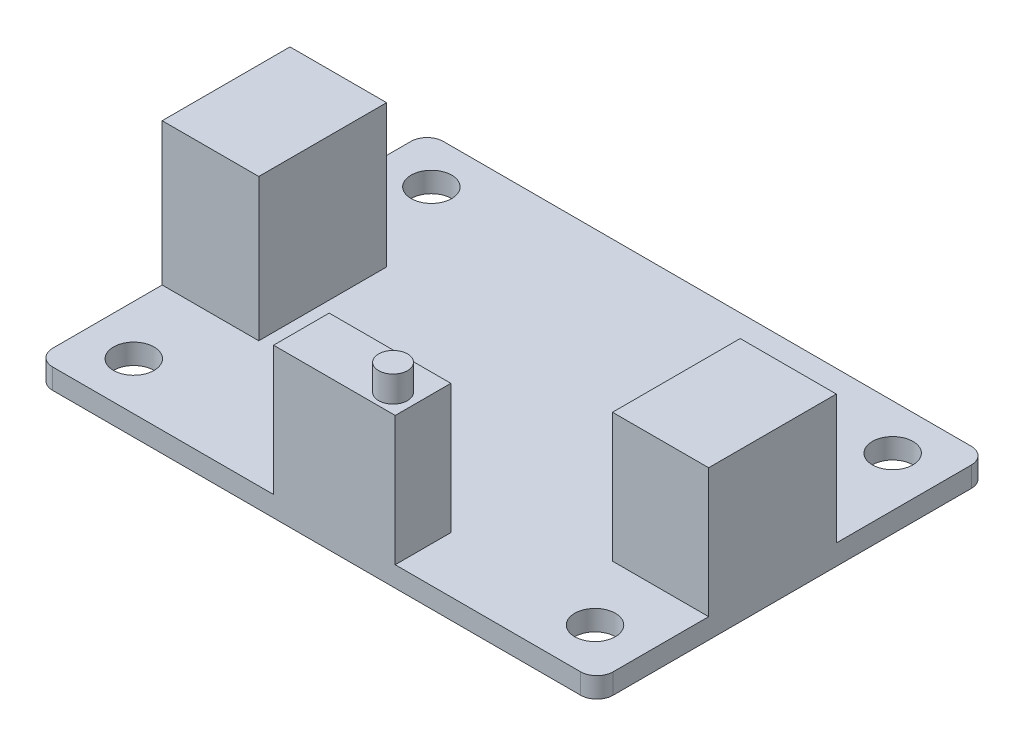
ISO-10303-21;
HEADER;
FILE_DESCRIPTION(('STEP AP214'),'2;1');
FILE_NAME('part.step','',(''),(''),'','','');
FILE_SCHEMA(('AUTOMOTIVE_DESIGN { 1 0 10303 214 1 1 1 1 }'));
ENDSEC;
DATA;
#1=APPLICATION_CONTEXT('core data for automotive mechanical design processes');
#2=APPLICATION_PROTOCOL_DEFINITION('international standard','automotive_design',2000,#1);
#3=PRODUCT_CONTEXT('',#1,'mechanical');
#4=PRODUCT('Part','Part','',(#3));
#5=PRODUCT_RELATED_PRODUCT_CATEGORY('part','',(#4));
#6=PRODUCT_DEFINITION_FORMATION('','',#4);
#7=PRODUCT_DEFINITION_CONTEXT('part definition',#1,'design');
#8=PRODUCT_DEFINITION('design','',#6,#7);
#9=PRODUCT_DEFINITION_SHAPE('','',#8);
#10=(LENGTH_UNIT() NAMED_UNIT(*) SI_UNIT(.MILLI.,.METRE.));
#11=(NAMED_UNIT(*) PLANE_ANGLE_UNIT() SI_UNIT($,.RADIAN.));
#12=(NAMED_UNIT(*) SI_UNIT($,.STERADIAN.) SOLID_ANGLE_UNIT());
#13=UNCERTAINTY_MEASURE_WITH_UNIT(LENGTH_MEASURE(1.E-05),#10,'distance_accuracy_value','');
#14=(GEOMETRIC_REPRESENTATION_CONTEXT(3) GLOBAL_UNCERTAINTY_ASSIGNED_CONTEXT((#13)) GLOBAL_UNIT_ASSIGNED_CONTEXT((#10,
#11,#12)) REPRESENTATION_CONTEXT('',''));
#15=CARTESIAN_POINT('',(0.,0.,0.));
#16=DIRECTION('',(0.,0.,1.));
#17=DIRECTION('',(1.,0.,0.));
#18=AXIS2_PLACEMENT_3D('',#15,#16,#17);
#19=CARTESIAN_POINT('',(0.,1.5875,0.));
#20=DIRECTION('',(0.,1.,0.));
#21=DIRECTION('',(0.,0.,1.));
#22=AXIS2_PLACEMENT_3D('',#19,#20,#21);
#23=PLANE('',#22);
#24=DIRECTION('',(-1.,0.,0.));
#25=VECTOR('',#24,1.);
#26=CARTESIAN_POINT('',(-14.3385610708236,1.5875,5.52960518081426));
#27=LINE('',#26,#25);
#28=CARTESIAN_POINT('',(-14.3385610708236,1.5875,5.52960518081426));
#29=VERTEX_POINT('',#28);
#30=CARTESIAN_POINT('',(-21.8823610708236,1.5875,5.52960518081426));
#31=VERTEX_POINT('',#30);
#32=EDGE_CURVE('E217',#29,#31,#27,.T.);
#33=ORIENTED_EDGE('',*,*,#32,.T.);
#34=DIRECTION('',(0.,0.,-1.));
#35=VECTOR('',#34,1.);
#36=CARTESIAN_POINT('',(-21.8823610708236,1.5875,0.));
#37=LINE('',#36,#35);
#38=CARTESIAN_POINT('',(-21.8823610708236,1.5875,14.0767051808143));
#39=VERTEX_POINT('',#38);
#40=EDGE_CURVE('E196',#39,#31,#37,.T.);
#41=ORIENTED_EDGE('',*,*,#40,.F.);
#42=CARTESIAN_POINT('',(-20.6123610708236,1.5875,14.0767051808143));
#43=DIRECTION('',(0.,1.,0.));
#44=DIRECTION('',(0.,0.,1.));
#45=AXIS2_PLACEMENT_3D('',#42,#43,#44);
#46=CIRCLE('',#45,1.27);
#47=CARTESIAN_POINT('',(-20.6123610708236,1.5875,15.3467051808143));
#48=VERTEX_POINT('',#47);
#49=EDGE_CURVE('E347',#39,#48,#46,.T.);
#50=ORIENTED_EDGE('',*,*,#49,.T.);
#51=DIRECTION('',(1.,0.,0.));
#52=VECTOR('',#51,1.);
#53=CARTESIAN_POINT('',(0.,1.5875,15.3467051808143));
#54=LINE('',#53,#52);
#55=CARTESIAN_POINT('',(-3.36576107082365,1.5875,15.3467051808143));
#56=VERTEX_POINT('',#55);
#57=EDGE_CURVE('E351',#48,#56,#54,.T.);
#58=ORIENTED_EDGE('',*,*,#57,.T.);
#59=DIRECTION('',(0.,0.,1.));
#60=VECTOR('',#59,1.);
#61=CARTESIAN_POINT('',(-3.36576107082365,1.5875,11.0033051808143));
#62=LINE('',#61,#60);
#63=CARTESIAN_POINT('',(-3.36576107082365,1.5875,11.0033051808143));
#64=VERTEX_POINT('',#63);
#65=EDGE_CURVE('E238',#64,#56,#62,.T.);
#66=ORIENTED_EDGE('',*,*,#65,.F.);
#67=DIRECTION('',(1.,0.,0.));
#68=VECTOR('',#67,1.);
#69=CARTESIAN_POINT('',(-3.36576107082365,1.5875,11.0033051808143));
#70=LINE('',#69,#68);
#71=CARTESIAN_POINT('',(6.13383892917635,1.5875,11.0033051808143));
#72=VERTEX_POINT('',#71);
#73=EDGE_CURVE('E65',#64,#72,#70,.T.);
#74=ORIENTED_EDGE('',*,*,#73,.T.);
#75=DIRECTION('',(0.,0.,1.));
#76=VECTOR('',#75,1.);
#77=CARTESIAN_POINT('',(6.13383892917635,1.5875,11.0033051808143));
#78=LINE('',#77,#76);
#79=CARTESIAN_POINT('',(6.13383892917635,1.5875,15.3467051808143));
#80=VERTEX_POINT('',#79);
#81=EDGE_CURVE('E233',#72,#80,#78,.T.);
#82=ORIENTED_EDGE('',*,*,#81,.T.);
#83=CARTESIAN_POINT('',(20.6118389291763,1.5875,15.3467051808143));
#84=VERTEX_POINT('',#83);
#85=EDGE_CURVE('E350',#80,#84,#54,.T.);
#86=ORIENTED_EDGE('',*,*,#85,.T.);
#87=CARTESIAN_POINT('',(20.6118389291763,1.5875,14.0767051808143));
#88=DIRECTION('',(0.,1.,0.));
#89=DIRECTION('',(0.,0.,1.));
#90=AXIS2_PLACEMENT_3D('',#87,#88,#89);
#91=CIRCLE('',#90,1.27);
#92=CARTESIAN_POINT('',(21.8818389291763,1.5875,14.0767051808143));
#93=VERTEX_POINT('',#92);
#94=EDGE_CURVE('E354',#93,#84,#91,.F.);
#95=ORIENTED_EDGE('',*,*,#94,.F.);
#96=DIRECTION('',(0.,0.,-1.));
#97=VECTOR('',#96,1.);
#98=CARTESIAN_POINT('',(21.8818389291763,1.5875,0.));
#99=LINE('',#98,#97);
#100=CARTESIAN_POINT('',(21.8818389291763,1.5875,6.62180518081426));
#101=VERTEX_POINT('',#100);
#102=EDGE_CURVE('E329',#93,#101,#99,.T.);
#103=ORIENTED_EDGE('',*,*,#102,.T.);
#104=DIRECTION('',(1.,0.,0.));
#105=VECTOR('',#104,1.);
#106=CARTESIAN_POINT('',(14.3761389291763,1.5875,6.62180518081426));
#107=LINE('',#106,#105);
#108=CARTESIAN_POINT('',(14.3761389291763,1.5875,6.62180518081426));
#109=VERTEX_POINT('',#108);
#110=EDGE_CURVE('E291',#109,#101,#107,.T.);
#111=ORIENTED_EDGE('',*,*,#110,.F.);
#112=DIRECTION('',(0.,0.,-1.));
#113=VECTOR('',#112,1.);
#114=CARTESIAN_POINT('',(14.3761389291763,1.5875,6.62180518081426));
#115=LINE('',#114,#113);
#116=CARTESIAN_POINT('',(14.3761389291763,1.5875,-3.34769481918574));
#117=VERTEX_POINT('',#116);
#118=EDGE_CURVE('E277',#109,#117,#115,.T.);
#119=ORIENTED_EDGE('',*,*,#118,.T.);
#120=DIRECTION('',(1.,0.,0.));
#121=VECTOR('',#120,1.);
#122=CARTESIAN_POINT('',(14.3761389291763,1.5875,-3.34769481918574));
#123=LINE('',#122,#121);
#124=CARTESIAN_POINT('',(21.8818389291763,1.5875,-3.34769481918574));
#125=VERTEX_POINT('',#124);
#126=EDGE_CURVE('E271',#117,#125,#123,.T.);
#127=ORIENTED_EDGE('',*,*,#126,.T.);
#128=CARTESIAN_POINT('',(21.8818389291763,1.5875,-13.8886948191857));
#129=VERTEX_POINT('',#128);
#130=EDGE_CURVE('E328',#125,#129,#99,.T.);
#131=ORIENTED_EDGE('',*,*,#130,.T.);
#132=CARTESIAN_POINT('',(20.6118389291764,1.5875,-13.8886948191857));
#133=DIRECTION('',(0.,1.,0.));
#134=DIRECTION('',(0.,0.,1.));
#135=AXIS2_PLACEMENT_3D('',#132,#133,#134);
#136=CIRCLE('',#135,1.26999999999999);
#137=CARTESIAN_POINT('',(20.6118389291764,1.5875,-15.1586948191857));
#138=VERTEX_POINT('',#137);
#139=EDGE_CURVE('E333',#129,#138,#136,.T.);
#140=ORIENTED_EDGE('',*,*,#139,.T.);
#141=DIRECTION('',(1.,0.,0.));
#142=VECTOR('',#141,1.);
#143=CARTESIAN_POINT('',(0.,1.5875,-15.1586948191857));
#144=LINE('',#143,#142);
#145=CARTESIAN_POINT('',(-20.6123610708236,1.5875,-15.1586948191857));
#146=VERTEX_POINT('',#145);
#147=EDGE_CURVE('E336',#146,#138,#144,.T.);
#148=ORIENTED_EDGE('',*,*,#147,.F.);
#149=CARTESIAN_POINT('',(-20.6123610708236,1.5875,-13.8886948191857));
#150=DIRECTION('',(0.,1.,0.));
#151=DIRECTION('',(0.,0.,1.));
#152=AXIS2_PLACEMENT_3D('',#149,#150,#151);
#153=CIRCLE('',#152,1.27);
#154=CARTESIAN_POINT('',(-21.8823610708236,1.5875,-13.8886948191857));
#155=VERTEX_POINT('',#154);
#156=EDGE_CURVE('E340',#155,#146,#153,.F.);
#157=ORIENTED_EDGE('',*,*,#156,.F.);
#158=CARTESIAN_POINT('',(-21.8823610708236,1.5875,-4.45259481918574));
#159=VERTEX_POINT('',#158);
#160=EDGE_CURVE('E344',#159,#155,#37,.T.);
#161=ORIENTED_EDGE('',*,*,#160,.F.);
#162=DIRECTION('',(-1.,0.,0.));
#163=VECTOR('',#162,1.);
#164=CARTESIAN_POINT('',(-14.3385610708236,1.5875,-4.45259481918574));
#165=LINE('',#164,#163);
#166=CARTESIAN_POINT('',(-14.3385610708236,1.5875,-4.45259481918574));
#167=VERTEX_POINT('',#166);
#168=EDGE_CURVE('E210',#167,#159,#165,.T.);
#169=ORIENTED_EDGE('',*,*,#168,.F.);
#170=DIRECTION('',(0.,0.,1.));
#171=VECTOR('',#170,1.);
#172=CARTESIAN_POINT('',(-14.3385610708236,1.5875,-4.45259481918574));
#173=LINE('',#172,#171);
#174=EDGE_CURVE('E206',#167,#29,#173,.T.);
#175=ORIENTED_EDGE('',*,*,#174,.T.);
#176=EDGE_LOOP('',(#33,#41,#50,#58,#66,#74,#82,#86,#95,#103,#111,#119,#127,#131,#140,#148,#157,
#161,#169,#175));
#177=FACE_BOUND('',#176,.T.);
#178=CARTESIAN_POINT('',(18.0086,1.5875,-11.6205));
#179=DIRECTION('',(0.,1.,0.));
#180=DIRECTION('',(0.,0.,1.));
#181=AXIS2_PLACEMENT_3D('',#178,#179,#180);
#182=CIRCLE('',#181,1.5875);
#183=CARTESIAN_POINT('',(18.0086,1.5875,-10.033));
#184=VERTEX_POINT('',#183);
#185=EDGE_CURVE('E311',#184,#184,#182,.F.);
#186=ORIENTED_EDGE('',*,*,#185,.T.);
#187=EDGE_LOOP('',(#186));
#188=FACE_BOUND('',#187,.T.);
#189=CARTESIAN_POINT('',(-18.0086,1.5875,-11.6205));
#190=DIRECTION('',(0.,1.,0.));
#191=DIRECTION('',(0.,0.,1.));
#192=AXIS2_PLACEMENT_3D('',#189,#190,#191);
#193=CIRCLE('',#192,1.5875);
#194=CARTESIAN_POINT('',(-18.0086,1.5875,-10.033));
#195=VERTEX_POINT('',#194);
#196=EDGE_CURVE('E315',#195,#195,#193,.T.);
#197=ORIENTED_EDGE('',*,*,#196,.F.);
#198=EDGE_LOOP('',(#197));
#199=FACE_BOUND('',#198,.T.);
#200=CARTESIAN_POINT('',(-18.0086,1.5875,11.6205));
#201=DIRECTION('',(0.,1.,0.));
#202=DIRECTION('',(0.,0.,1.));
#203=AXIS2_PLACEMENT_3D('',#200,#201,#202);
#204=CIRCLE('',#203,1.5875);
#205=CARTESIAN_POINT('',(-18.0086,1.5875,13.208));
#206=VERTEX_POINT('',#205);
#207=EDGE_CURVE('E320',#206,#206,#204,.F.);
#208=ORIENTED_EDGE('',*,*,#207,.T.);
#209=EDGE_LOOP('',(#208));
#210=FACE_BOUND('',#209,.T.);
#211=CARTESIAN_POINT('',(18.0086,1.5875,11.6205));
#212=DIRECTION('',(0.,1.,0.));
#213=DIRECTION('',(0.,0.,1.));
#214=AXIS2_PLACEMENT_3D('',#211,#212,#213);
#215=CIRCLE('',#214,1.5875);
#216=CARTESIAN_POINT('',(18.0086,1.5875,13.208));
#217=VERTEX_POINT('',#216);
#218=EDGE_CURVE('E324',#217,#217,#215,.T.);
#219=ORIENTED_EDGE('',*,*,#218,.F.);
#220=EDGE_LOOP('',(#219));
#221=FACE_BOUND('',#220,.T.);
#222=ADVANCED_FACE('F41',(#177,#188,#199,#210,#221),#23,.T.);
#223=CARTESIAN_POINT('',(21.8818389291763,1.5875,0.));
#224=DIRECTION('',(-1.,0.,0.));
#225=DIRECTION('',(0.,0.,1.));
#226=AXIS2_PLACEMENT_3D('',#223,#224,#225);
#227=PLANE('',#226);
#228=DIRECTION('',(0.,0.,-1.));
#229=VECTOR('',#228,1.);
#230=CARTESIAN_POINT('',(21.8818389291763,0.,0.));
#231=LINE('',#230,#229);
#232=CARTESIAN_POINT('',(21.8818389291763,0.,14.0767051808143));
#233=VERTEX_POINT('',#232);
#234=CARTESIAN_POINT('',(21.8818389291763,0.,-13.8886948191857));
#235=VERTEX_POINT('',#234);
#236=EDGE_CURVE('E374',#233,#235,#231,.T.);
#237=ORIENTED_EDGE('',*,*,#236,.T.);
#238=DIRECTION('',(0.,-1.,0.));
#239=VECTOR('',#238,1.);
#240=CARTESIAN_POINT('',(21.8818389291763,1.5875,-13.8886948191857));
#241=LINE('',#240,#239);
#242=EDGE_CURVE('E50',#129,#235,#241,.T.);
#243=ORIENTED_EDGE('',*,*,#242,.F.);
#244=ORIENTED_EDGE('',*,*,#130,.F.);
#245=DIRECTION('',(0.,-1.,0.));
#246=VECTOR('',#245,1.);
#247=CARTESIAN_POINT('',(21.8818389291763,11.6586,-3.34769481918574));
#248=LINE('',#247,#246);
#249=CARTESIAN_POINT('',(21.8818389291763,11.6586,-3.34769481918574));
#250=VERTEX_POINT('',#249);
#251=EDGE_CURVE('E287',#250,#125,#248,.T.);
#252=ORIENTED_EDGE('',*,*,#251,.F.);
#253=DIRECTION('',(0.,0.,-1.));
#254=VECTOR('',#253,1.);
#255=CARTESIAN_POINT('',(21.8818389291763,11.6586,6.62180518081426));
#256=LINE('',#255,#254);
#257=CARTESIAN_POINT('',(21.8818389291763,11.6586,6.62180518081426));
#258=VERTEX_POINT('',#257);
#259=EDGE_CURVE('E276',#258,#250,#256,.T.);
#260=ORIENTED_EDGE('',*,*,#259,.F.);
#261=DIRECTION('',(0.,-1.,0.));
#262=VECTOR('',#261,1.);
#263=CARTESIAN_POINT('',(21.8818389291763,11.6586,6.62180518081426));
#264=LINE('',#263,#262);
#265=EDGE_CURVE('E305',#258,#101,#264,.T.);
#266=ORIENTED_EDGE('',*,*,#265,.T.);
#267=ORIENTED_EDGE('',*,*,#102,.F.);
#268=DIRECTION('',(0.,-1.,0.));
#269=VECTOR('',#268,1.);
#270=CARTESIAN_POINT('',(21.8818389291763,1.5875,14.0767051808143));
#271=LINE('',#270,#269);
#272=EDGE_CURVE('E358',#93,#233,#271,.T.);
#273=ORIENTED_EDGE('',*,*,#272,.T.);
#274=EDGE_LOOP('',(#237,#243,#244,#252,#260,#266,#267,#273));
#275=FACE_BOUND('',#274,.T.);
#276=ADVANCED_FACE('F434',(#275),#227,.F.);
#277=CARTESIAN_POINT('',(20.6118389291764,1.5875,-13.8886948191857));
#278=DIRECTION('',(0.,-1.,0.));
#279=DIRECTION('',(0.,0.,-1.));
#280=AXIS2_PLACEMENT_3D('',#277,#278,#279);
#281=CYLINDRICAL_SURFACE('',#280,1.26999999999999);
#282=CARTESIAN_POINT('',(20.6118389291764,0.,-13.8886948191857));
#283=DIRECTION('',(0.,1.,0.));
#284=DIRECTION('',(0.,0.,1.));
#285=AXIS2_PLACEMENT_3D('',#282,#283,#284);
#286=CIRCLE('',#285,1.26999999999999);
#287=CARTESIAN_POINT('',(20.6118389291764,0.,-15.1586948191857));
#288=VERTEX_POINT('',#287);
#289=EDGE_CURVE('E378',#235,#288,#286,.T.);
#290=ORIENTED_EDGE('',*,*,#289,.T.);
#291=DIRECTION('',(0.,-1.,0.));
#292=VECTOR('',#291,1.);
#293=CARTESIAN_POINT('',(20.6118389291764,1.5875,-15.1586948191857));
#294=LINE('',#293,#292);
#295=EDGE_CURVE('E422',#138,#288,#294,.T.);
#296=ORIENTED_EDGE('',*,*,#295,.F.);
#297=ORIENTED_EDGE('',*,*,#139,.F.);
#298=ORIENTED_EDGE('',*,*,#242,.T.);
#299=EDGE_LOOP('',(#290,#296,#297,#298));
#300=FACE_BOUND('',#299,.T.);
#301=ADVANCED_FACE('F429',(#300),#281,.T.);
#302=CARTESIAN_POINT('',(0.,1.5875,-15.1586948191857));
#303=DIRECTION('',(0.,0.,-1.));
#304=DIRECTION('',(-1.,0.,0.));
#305=AXIS2_PLACEMENT_3D('',#302,#303,#304);
#306=PLANE('',#305);
#307=DIRECTION('',(1.,0.,0.));
#308=VECTOR('',#307,1.);
#309=CARTESIAN_POINT('',(0.,0.,-15.1586948191857));
#310=LINE('',#309,#308);
#311=CARTESIAN_POINT('',(-20.6123610708236,0.,-15.1586948191857));
#312=VERTEX_POINT('',#311);
#313=EDGE_CURVE('E382',#312,#288,#310,.T.);
#314=ORIENTED_EDGE('',*,*,#313,.F.);
#315=DIRECTION('',(0.,-1.,0.));
#316=VECTOR('',#315,1.);
#317=CARTESIAN_POINT('',(-20.6123610708236,1.5875,-15.1586948191857));
#318=LINE('',#317,#316);
#319=EDGE_CURVE('E419',#146,#312,#318,.T.);
#320=ORIENTED_EDGE('',*,*,#319,.F.);
#321=ORIENTED_EDGE('',*,*,#147,.T.);
#322=ORIENTED_EDGE('',*,*,#295,.T.);
#323=EDGE_LOOP('',(#314,#320,#321,#322));
#324=FACE_BOUND('',#323,.T.);
#325=ADVANCED_FACE('F459',(#324),#306,.T.);
#326=CARTESIAN_POINT('',(-20.6123610708236,1.5875,-13.8886948191857));
#327=DIRECTION('',(0.,-1.,0.));
#328=DIRECTION('',(0.,0.,-1.));
#329=AXIS2_PLACEMENT_3D('',#326,#327,#328);
#330=CYLINDRICAL_SURFACE('',#329,1.27);
#331=CARTESIAN_POINT('',(-20.6123610708236,0.,-13.8886948191857));
#332=DIRECTION('',(0.,1.,0.));
#333=DIRECTION('',(0.,0.,1.));
#334=AXIS2_PLACEMENT_3D('',#331,#332,#333);
#335=CIRCLE('',#334,1.27);
#336=CARTESIAN_POINT('',(-21.8823610708236,0.,-13.8886948191857));
#337=VERTEX_POINT('',#336);
#338=EDGE_CURVE('E386',#337,#312,#335,.F.);
#339=ORIENTED_EDGE('',*,*,#338,.F.);
#340=DIRECTION('',(0.,-1.,0.));
#341=VECTOR('',#340,1.);
#342=CARTESIAN_POINT('',(-21.8823610708236,1.5875,-13.8886948191857));
#343=LINE('',#342,#341);
#344=EDGE_CURVE('E416',#155,#337,#343,.T.);
#345=ORIENTED_EDGE('',*,*,#344,.F.);
#346=ORIENTED_EDGE('',*,*,#156,.T.);
#347=ORIENTED_EDGE('',*,*,#319,.T.);
#348=EDGE_LOOP('',(#339,#345,#346,#347));
#349=FACE_BOUND('',#348,.T.);
#350=ADVANCED_FACE('F456',(#349),#330,.T.);
#351=CARTESIAN_POINT('',(-21.8823610708236,1.5875,0.));
#352=DIRECTION('',(-1.,0.,0.));
#353=DIRECTION('',(0.,0.,1.));
#354=AXIS2_PLACEMENT_3D('',#351,#352,#353);
#355=PLANE('',#354);
#356=DIRECTION('',(0.,0.,-1.));
#357=VECTOR('',#356,1.);
#358=CARTESIAN_POINT('',(-21.8823610708236,0.,0.));
#359=LINE('',#358,#357);
#360=CARTESIAN_POINT('',(-21.8823610708236,0.,14.0767051808143));
#361=VERTEX_POINT('',#360);
#362=EDGE_CURVE('E390',#361,#337,#359,.T.);
#363=ORIENTED_EDGE('',*,*,#362,.F.);
#364=DIRECTION('',(0.,-1.,0.));
#365=VECTOR('',#364,1.);
#366=CARTESIAN_POINT('',(-21.8823610708236,1.5875,14.0767051808143));
#367=LINE('',#366,#365);
#368=EDGE_CURVE('E413',#39,#361,#367,.T.);
#369=ORIENTED_EDGE('',*,*,#368,.F.);
#370=ORIENTED_EDGE('',*,*,#40,.T.);
#371=DIRECTION('',(0.,-1.,0.));
#372=VECTOR('',#371,1.);
#373=CARTESIAN_POINT('',(-21.8823610708236,12.7,5.52960518081426));
#374=LINE('',#373,#372);
#375=CARTESIAN_POINT('',(-21.8823610708236,12.7,5.52960518081426));
#376=VERTEX_POINT('',#375);
#377=EDGE_CURVE('E192',#376,#31,#374,.T.);
#378=ORIENTED_EDGE('',*,*,#377,.F.);
#379=DIRECTION('',(0.,0.,1.));
#380=VECTOR('',#379,1.);
#381=CARTESIAN_POINT('',(-21.8823610708236,12.7,-4.45259481918574));
#382=LINE('',#381,#380);
#383=CARTESIAN_POINT('',(-21.8823610708236,12.7,-4.45259481918574));
#384=VERTEX_POINT('',#383);
#385=EDGE_CURVE('E180',#384,#376,#382,.T.);
#386=ORIENTED_EDGE('',*,*,#385,.F.);
#387=DIRECTION('',(0.,-1.,0.));
#388=VECTOR('',#387,1.);
#389=CARTESIAN_POINT('',(-21.8823610708236,12.7,-4.45259481918574));
#390=LINE('',#389,#388);
#391=EDGE_CURVE('E57',#384,#159,#390,.T.);
#392=ORIENTED_EDGE('',*,*,#391,.T.);
#393=ORIENTED_EDGE('',*,*,#160,.T.);
#394=ORIENTED_EDGE('',*,*,#344,.T.);
#395=EDGE_LOOP('',(#363,#369,#370,#378,#386,#392,#393,#394));
#396=FACE_BOUND('',#395,.T.);
#397=ADVANCED_FACE('F194',(#396),#355,.T.);
#398=CARTESIAN_POINT('',(-20.6123610708236,1.5875,14.0767051808143));
#399=DIRECTION('',(0.,-1.,0.));
#400=DIRECTION('',(0.,0.,-1.));
#401=AXIS2_PLACEMENT_3D('',#398,#399,#400);
#402=CYLINDRICAL_SURFACE('',#401,1.27);
#403=CARTESIAN_POINT('',(-20.6123610708236,0.,14.0767051808143));
#404=DIRECTION('',(0.,1.,0.));
#405=DIRECTION('',(0.,0.,1.));
#406=AXIS2_PLACEMENT_3D('',#403,#404,#405);
#407=CIRCLE('',#406,1.27);
#408=CARTESIAN_POINT('',(-20.6123610708236,0.,15.3467051808143));
#409=VERTEX_POINT('',#408);
#410=EDGE_CURVE('E394',#361,#409,#407,.T.);
#411=ORIENTED_EDGE('',*,*,#410,.T.);
#412=DIRECTION('',(0.,-1.,0.));
#413=VECTOR('',#412,1.);
#414=CARTESIAN_POINT('',(-20.6123610708236,1.5875,15.3467051808143));
#415=LINE('',#414,#413);
#416=EDGE_CURVE('E409',#48,#409,#415,.T.);
#417=ORIENTED_EDGE('',*,*,#416,.F.);
#418=ORIENTED_EDGE('',*,*,#49,.F.);
#419=ORIENTED_EDGE('',*,*,#368,.T.);
#420=EDGE_LOOP('',(#411,#417,#418,#419));
#421=FACE_BOUND('',#420,.T.);
#422=ADVANCED_FACE('F481',(#421),#402,.T.);
#423=CARTESIAN_POINT('',(0.,1.5875,15.3467051808143));
#424=DIRECTION('',(0.,0.,-1.));
#425=DIRECTION('',(-1.,0.,0.));
#426=AXIS2_PLACEMENT_3D('',#423,#424,#425);
#427=PLANE('',#426);
#428=DIRECTION('',(1.,0.,0.));
#429=VECTOR('',#428,1.);
#430=CARTESIAN_POINT('',(0.,0.,15.3467051808143));
#431=LINE('',#430,#429);
#432=CARTESIAN_POINT('',(20.6118389291763,0.,15.3467051808143));
#433=VERTEX_POINT('',#432);
#434=EDGE_CURVE('E397',#409,#433,#431,.T.);
#435=ORIENTED_EDGE('',*,*,#434,.T.);
#436=DIRECTION('',(0.,-1.,0.));
#437=VECTOR('',#436,1.);
#438=CARTESIAN_POINT('',(20.6118389291763,1.5875,15.3467051808143));
#439=LINE('',#438,#437);
#440=EDGE_CURVE('E406',#84,#433,#439,.T.);
#441=ORIENTED_EDGE('',*,*,#440,.F.);
#442=ORIENTED_EDGE('',*,*,#85,.F.);
#443=DIRECTION('',(0.,-1.,0.));
#444=VECTOR('',#443,1.);
#445=CARTESIAN_POINT('',(6.13383892917635,11.684,15.3467051808143));
#446=LINE('',#445,#444);
#447=CARTESIAN_POINT('',(6.13383892917635,11.684,15.3467051808143));
#448=VERTEX_POINT('',#447);
#449=EDGE_CURVE('E267',#448,#80,#446,.T.);
#450=ORIENTED_EDGE('',*,*,#449,.F.);
#451=DIRECTION('',(1.,0.,0.));
#452=VECTOR('',#451,1.);
#453=CARTESIAN_POINT('',(-3.36576107082365,11.684,15.3467051808143));
#454=LINE('',#453,#452);
#455=CARTESIAN_POINT('',(-3.36576107082365,11.684,15.3467051808143));
#456=VERTEX_POINT('',#455);
#457=EDGE_CURVE('E234',#456,#448,#454,.T.);
#458=ORIENTED_EDGE('',*,*,#457,.F.);
#459=DIRECTION('',(0.,-1.,0.));
#460=VECTOR('',#459,1.);
#461=CARTESIAN_POINT('',(-3.36576107082365,11.684,15.3467051808143));
#462=LINE('',#461,#460);
#463=EDGE_CURVE('E249',#456,#56,#462,.T.);
#464=ORIENTED_EDGE('',*,*,#463,.T.);
#465=ORIENTED_EDGE('',*,*,#57,.F.);
#466=ORIENTED_EDGE('',*,*,#416,.T.);
#467=EDGE_LOOP('',(#435,#441,#442,#450,#458,#464,#465,#466));
#468=FACE_BOUND('',#467,.T.);
#469=ADVANCED_FACE('F445',(#468),#427,.F.);
#470=CARTESIAN_POINT('',(18.0086,1.5875,11.6205));
#471=DIRECTION('',(0.,-1.,0.));
#472=DIRECTION('',(0.,0.,-1.));
#473=AXIS2_PLACEMENT_3D('',#470,#471,#472);
#474=CYLINDRICAL_SURFACE('',#473,1.5875);
#475=ORIENTED_EDGE('',*,*,#218,.T.);
#476=EDGE_LOOP('',(#475));
#477=FACE_BOUND('',#476,.T.);
#478=CARTESIAN_POINT('',(18.0086,0.,11.6205));
#479=DIRECTION('',(0.,1.,0.));
#480=DIRECTION('',(0.,0.,1.));
#481=AXIS2_PLACEMENT_3D('',#478,#479,#480);
#482=CIRCLE('',#481,1.5875);
#483=CARTESIAN_POINT('',(18.0086,0.,13.208));
#484=VERTEX_POINT('',#483);
#485=EDGE_CURVE('E370',#484,#484,#482,.T.);
#486=ORIENTED_EDGE('',*,*,#485,.F.);
#487=EDGE_LOOP('',(#486));
#488=FACE_BOUND('',#487,.T.);
#489=ADVANCED_FACE('F488',(#477,#488),#474,.F.);
#490=CARTESIAN_POINT('',(-18.0086,1.5875,11.6205));
#491=DIRECTION('',(0.,-1.,0.));
#492=DIRECTION('',(0.,0.,-1.));
#493=AXIS2_PLACEMENT_3D('',#490,#491,#492);
#494=CYLINDRICAL_SURFACE('',#493,1.5875);
#495=ORIENTED_EDGE('',*,*,#207,.F.);
#496=EDGE_LOOP('',(#495));
#497=FACE_BOUND('',#496,.T.);
#498=CARTESIAN_POINT('',(-18.0086,0.,11.6205));
#499=DIRECTION('',(0.,1.,0.));
#500=DIRECTION('',(0.,0.,1.));
#501=AXIS2_PLACEMENT_3D('',#498,#499,#500);
#502=CIRCLE('',#501,1.5875);
#503=CARTESIAN_POINT('',(-18.0086,0.,13.208));
#504=VERTEX_POINT('',#503);
#505=EDGE_CURVE('E366',#504,#504,#502,.F.);
#506=ORIENTED_EDGE('',*,*,#505,.T.);
#507=EDGE_LOOP('',(#506));
#508=FACE_BOUND('',#507,.T.);
#509=ADVANCED_FACE('F513',(#497,#508),#494,.F.);
#510=CARTESIAN_POINT('',(-18.0086,1.5875,-11.6205));
#511=DIRECTION('',(0.,-1.,0.));
#512=DIRECTION('',(0.,0.,-1.));
#513=AXIS2_PLACEMENT_3D('',#510,#511,#512);
#514=CYLINDRICAL_SURFACE('',#513,1.5875);
#515=ORIENTED_EDGE('',*,*,#196,.T.);
#516=EDGE_LOOP('',(#515));
#517=FACE_BOUND('',#516,.T.);
#518=CARTESIAN_POINT('',(-18.0086,0.,-11.6205));
#519=DIRECTION('',(0.,1.,0.));
#520=DIRECTION('',(0.,0.,1.));
#521=AXIS2_PLACEMENT_3D('',#518,#519,#520);
#522=CIRCLE('',#521,1.5875);
#523=CARTESIAN_POINT('',(-18.0086,0.,-10.033));
#524=VERTEX_POINT('',#523);
#525=EDGE_CURVE('E362',#524,#524,#522,.T.);
#526=ORIENTED_EDGE('',*,*,#525,.F.);
#527=EDGE_LOOP('',(#526));
#528=FACE_BOUND('',#527,.T.);
#529=ADVANCED_FACE('F508',(#517,#528),#514,.F.);
#530=CARTESIAN_POINT('',(18.0086,1.5875,-11.6205));
#531=DIRECTION('',(0.,-1.,0.));
#532=DIRECTION('',(0.,0.,-1.));
#533=AXIS2_PLACEMENT_3D('',#530,#531,#532);
#534=CYLINDRICAL_SURFACE('',#533,1.5875);
#535=ORIENTED_EDGE('',*,*,#185,.F.);
#536=EDGE_LOOP('',(#535));
#537=FACE_BOUND('',#536,.T.);
#538=CARTESIAN_POINT('',(18.0086,0.,-11.6205));
#539=DIRECTION('',(0.,1.,0.));
#540=DIRECTION('',(0.,0.,1.));
#541=AXIS2_PLACEMENT_3D('',#538,#539,#540);
#542=CIRCLE('',#541,1.5875);
#543=CARTESIAN_POINT('',(18.0086,0.,-10.033));
#544=VERTEX_POINT('',#543);
#545=EDGE_CURVE('E301',#544,#544,#542,.F.);
#546=ORIENTED_EDGE('',*,*,#545,.T.);
#547=EDGE_LOOP('',(#546));
#548=FACE_BOUND('',#547,.T.);
#549=ADVANCED_FACE('F43',(#537,#548),#534,.F.);
#550=CARTESIAN_POINT('',(20.6118389291763,1.5875,14.0767051808143));
#551=DIRECTION('',(0.,-1.,0.));
#552=DIRECTION('',(0.,0.,-1.));
#553=AXIS2_PLACEMENT_3D('',#550,#551,#552);
#554=CYLINDRICAL_SURFACE('',#553,1.27);
#555=CARTESIAN_POINT('',(20.6118389291763,0.,14.0767051808143));
#556=DIRECTION('',(0.,1.,0.));
#557=DIRECTION('',(0.,0.,1.));
#558=AXIS2_PLACEMENT_3D('',#555,#556,#557);
#559=CIRCLE('',#558,1.27);
#560=EDGE_CURVE('E316',#233,#433,#559,.F.);
#561=ORIENTED_EDGE('',*,*,#560,.F.);
#562=ORIENTED_EDGE('',*,*,#272,.F.);
#563=ORIENTED_EDGE('',*,*,#94,.T.);
#564=ORIENTED_EDGE('',*,*,#440,.T.);
#565=EDGE_LOOP('',(#561,#562,#563,#564));
#566=FACE_BOUND('',#565,.T.);
#567=ADVANCED_FACE('F441',(#566),#554,.T.);
#568=CARTESIAN_POINT('',(0.,0.,0.));
#569=DIRECTION('',(0.,1.,0.));
#570=DIRECTION('',(0.,0.,1.));
#571=AXIS2_PLACEMENT_3D('',#568,#569,#570);
#572=PLANE('',#571);
#573=ORIENTED_EDGE('',*,*,#545,.F.);
#574=EDGE_LOOP('',(#573));
#575=FACE_BOUND('',#574,.T.);
#576=ORIENTED_EDGE('',*,*,#525,.T.);
#577=EDGE_LOOP('',(#576));
#578=FACE_BOUND('',#577,.T.);
#579=ORIENTED_EDGE('',*,*,#505,.F.);
#580=EDGE_LOOP('',(#579));
#581=FACE_BOUND('',#580,.T.);
#582=ORIENTED_EDGE('',*,*,#485,.T.);
#583=EDGE_LOOP('',(#582));
#584=FACE_BOUND('',#583,.T.);
#585=ORIENTED_EDGE('',*,*,#236,.F.);
#586=ORIENTED_EDGE('',*,*,#560,.T.);
#587=ORIENTED_EDGE('',*,*,#434,.F.);
#588=ORIENTED_EDGE('',*,*,#410,.F.);
#589=ORIENTED_EDGE('',*,*,#362,.T.);
#590=ORIENTED_EDGE('',*,*,#338,.T.);
#591=ORIENTED_EDGE('',*,*,#313,.T.);
#592=ORIENTED_EDGE('',*,*,#289,.F.);
#593=EDGE_LOOP('',(#585,#586,#587,#588,#589,#590,#591,#592));
#594=FACE_BOUND('',#593,.T.);
#595=ADVANCED_FACE('F438',(#575,#578,#581,#584,#594),#572,.F.);
#596=CARTESIAN_POINT('',(14.3761389291763,11.6586,-3.34769481918574));
#597=DIRECTION('',(0.,0.,-1.));
#598=DIRECTION('',(-1.,0.,0.));
#599=AXIS2_PLACEMENT_3D('',#596,#597,#598);
#600=PLANE('',#599);
#601=ORIENTED_EDGE('',*,*,#126,.F.);
#602=DIRECTION('',(0.,-1.,0.));
#603=VECTOR('',#602,1.);
#604=CARTESIAN_POINT('',(14.3761389291763,11.6586,-3.34769481918574));
#605=LINE('',#604,#603);
#606=CARTESIAN_POINT('',(14.3761389291763,11.6586,-3.34769481918574));
#607=VERTEX_POINT('',#606);
#608=EDGE_CURVE('E297',#607,#117,#605,.T.);
#609=ORIENTED_EDGE('',*,*,#608,.F.);
#610=DIRECTION('',(1.,0.,0.));
#611=VECTOR('',#610,1.);
#612=CARTESIAN_POINT('',(14.3761389291763,11.6586,-3.34769481918574));
#613=LINE('',#612,#611);
#614=EDGE_CURVE('E272',#607,#250,#613,.T.);
#615=ORIENTED_EDGE('',*,*,#614,.T.);
#616=ORIENTED_EDGE('',*,*,#251,.T.);
#617=EDGE_LOOP('',(#601,#609,#615,#616));
#618=FACE_BOUND('',#617,.T.);
#619=ADVANCED_FACE('F499',(#618),#600,.T.);
#620=CARTESIAN_POINT('',(14.3761389291763,11.6586,6.62180518081426));
#621=DIRECTION('',(-1.,0.,0.));
#622=DIRECTION('',(0.,0.,1.));
#623=AXIS2_PLACEMENT_3D('',#620,#621,#622);
#624=PLANE('',#623);
#625=ORIENTED_EDGE('',*,*,#118,.F.);
#626=DIRECTION('',(0.,-1.,0.));
#627=VECTOR('',#626,1.);
#628=CARTESIAN_POINT('',(14.3761389291763,11.6586,6.62180518081426));
#629=LINE('',#628,#627);
#630=CARTESIAN_POINT('',(14.3761389291763,11.6586,6.62180518081426));
#631=VERTEX_POINT('',#630);
#632=EDGE_CURVE('E302',#631,#109,#629,.T.);
#633=ORIENTED_EDGE('',*,*,#632,.F.);
#634=DIRECTION('',(0.,0.,-1.));
#635=VECTOR('',#634,1.);
#636=CARTESIAN_POINT('',(14.3761389291763,11.6586,6.62180518081426));
#637=LINE('',#636,#635);
#638=EDGE_CURVE('E283',#631,#607,#637,.T.);
#639=ORIENTED_EDGE('',*,*,#638,.T.);
#640=ORIENTED_EDGE('',*,*,#608,.T.);
#641=EDGE_LOOP('',(#625,#633,#639,#640));
#642=FACE_BOUND('',#641,.T.);
#643=ADVANCED_FACE('F615',(#642),#624,.T.);
#644=CARTESIAN_POINT('',(14.3761389291763,11.6586,6.62180518081426));
#645=DIRECTION('',(0.,0.,-1.));
#646=DIRECTION('',(-1.,0.,0.));
#647=AXIS2_PLACEMENT_3D('',#644,#645,#646);
#648=PLANE('',#647);
#649=ORIENTED_EDGE('',*,*,#110,.T.);
#650=ORIENTED_EDGE('',*,*,#265,.F.);
#651=DIRECTION('',(1.,0.,0.));
#652=VECTOR('',#651,1.);
#653=CARTESIAN_POINT('',(14.3761389291763,11.6586,6.62180518081426));
#654=LINE('',#653,#652);
#655=EDGE_CURVE('E280',#631,#258,#654,.T.);
#656=ORIENTED_EDGE('',*,*,#655,.F.);
#657=ORIENTED_EDGE('',*,*,#632,.T.);
#658=EDGE_LOOP('',(#649,#650,#656,#657));
#659=FACE_BOUND('',#658,.T.);
#660=ADVANCED_FACE('F613',(#659),#648,.F.);
#661=CARTESIAN_POINT('',(0.,11.6586,0.));
#662=DIRECTION('',(0.,1.,0.));
#663=DIRECTION('',(0.,0.,1.));
#664=AXIS2_PLACEMENT_3D('',#661,#662,#663);
#665=PLANE('',#664);
#666=ORIENTED_EDGE('',*,*,#614,.F.);
#667=ORIENTED_EDGE('',*,*,#638,.F.);
#668=ORIENTED_EDGE('',*,*,#655,.T.);
#669=ORIENTED_EDGE('',*,*,#259,.T.);
#670=EDGE_LOOP('',(#666,#667,#668,#669));
#671=FACE_BOUND('',#670,.T.);
#672=ADVANCED_FACE('F610',(#671),#665,.T.);
#673=CARTESIAN_POINT('',(6.13383892917635,11.684,11.0033051808143));
#674=DIRECTION('',(1.,0.,0.));
#675=DIRECTION('',(0.,0.,-1.));
#676=AXIS2_PLACEMENT_3D('',#673,#674,#675);
#677=PLANE('',#676);
#678=ORIENTED_EDGE('',*,*,#81,.F.);
#679=DIRECTION('',(0.,-1.,0.));
#680=VECTOR('',#679,1.);
#681=CARTESIAN_POINT('',(6.13383892917635,11.684,11.0033051808143));
#682=LINE('',#681,#680);
#683=CARTESIAN_POINT('',(6.13383892917635,11.684,11.0033051808143));
#684=VERTEX_POINT('',#683);
#685=EDGE_CURVE('E264',#684,#72,#682,.T.);
#686=ORIENTED_EDGE('',*,*,#685,.F.);
#687=DIRECTION('',(0.,0.,1.));
#688=VECTOR('',#687,1.);
#689=CARTESIAN_POINT('',(6.13383892917635,11.684,11.0033051808143));
#690=LINE('',#689,#688);
#691=EDGE_CURVE('E237',#684,#448,#690,.T.);
#692=ORIENTED_EDGE('',*,*,#691,.T.);
#693=ORIENTED_EDGE('',*,*,#449,.T.);
#694=EDGE_LOOP('',(#678,#686,#692,#693));
#695=FACE_BOUND('',#694,.T.);
#696=ADVANCED_FACE('F471',(#695),#677,.T.);
#697=CARTESIAN_POINT('',(-3.36576107082365,11.684,11.0033051808143));
#698=DIRECTION('',(0.,0.,-1.));
#699=DIRECTION('',(-1.,0.,0.));
#700=AXIS2_PLACEMENT_3D('',#697,#698,#699);
#701=PLANE('',#700);
#702=ORIENTED_EDGE('',*,*,#73,.F.);
#703=DIRECTION('',(0.,-1.,0.));
#704=VECTOR('',#703,1.);
#705=CARTESIAN_POINT('',(-3.36576107082365,11.684,11.0033051808143));
#706=LINE('',#705,#704);
#707=CARTESIAN_POINT('',(-3.36576107082365,11.684,11.0033051808143));
#708=VERTEX_POINT('',#707);
#709=EDGE_CURVE('E260',#708,#64,#706,.T.);
#710=ORIENTED_EDGE('',*,*,#709,.F.);
#711=DIRECTION('',(1.,0.,0.));
#712=VECTOR('',#711,1.);
#713=CARTESIAN_POINT('',(-3.36576107082365,11.684,11.0033051808143));
#714=LINE('',#713,#712);
#715=EDGE_CURVE('E242',#708,#684,#714,.T.);
#716=ORIENTED_EDGE('',*,*,#715,.T.);
#717=ORIENTED_EDGE('',*,*,#685,.T.);
#718=EDGE_LOOP('',(#702,#710,#716,#717));
#719=FACE_BOUND('',#718,.T.);
#720=ADVANCED_FACE('F476',(#719),#701,.T.);
#721=CARTESIAN_POINT('',(-3.36576107082365,11.684,11.0033051808143));
#722=DIRECTION('',(1.,0.,0.));
#723=DIRECTION('',(0.,0.,-1.));
#724=AXIS2_PLACEMENT_3D('',#721,#722,#723);
#725=PLANE('',#724);
#726=ORIENTED_EDGE('',*,*,#65,.T.);
#727=ORIENTED_EDGE('',*,*,#463,.F.);
#728=DIRECTION('',(0.,0.,1.));
#729=VECTOR('',#728,1.);
#730=CARTESIAN_POINT('',(-3.36576107082365,11.684,11.0033051808143));
#731=LINE('',#730,#729);
#732=EDGE_CURVE('E246',#708,#456,#731,.T.);
#733=ORIENTED_EDGE('',*,*,#732,.F.);
#734=ORIENTED_EDGE('',*,*,#709,.T.);
#735=EDGE_LOOP('',(#726,#727,#733,#734));
#736=FACE_BOUND('',#735,.T.);
#737=ADVANCED_FACE('F480',(#736),#725,.F.);
#738=CARTESIAN_POINT('',(0.,11.684,0.));
#739=DIRECTION('',(0.,-1.,0.));
#740=DIRECTION('',(0.,0.,-1.));
#741=AXIS2_PLACEMENT_3D('',#738,#739,#740);
#742=PLANE('',#741);
#743=CARTESIAN_POINT('',(4.48570303916442,11.684,13.8659149984775));
#744=DIRECTION('',(0.,-1.,0.));
#745=DIRECTION('',(0.,0.,-1.));
#746=AXIS2_PLACEMENT_3D('',#743,#744,#745);
#747=CIRCLE('',#746,1.1303);
#748=CARTESIAN_POINT('',(4.48570303916442,11.684,12.7356149984775));
#749=VERTEX_POINT('',#748);
#750=EDGE_CURVE('E11',#749,#749,#747,.F.);
#751=ORIENTED_EDGE('',*,*,#750,.F.);
#752=EDGE_LOOP('',(#751));
#753=FACE_BOUND('',#752,.T.);
#754=ORIENTED_EDGE('',*,*,#457,.T.);
#755=ORIENTED_EDGE('',*,*,#691,.F.);
#756=ORIENTED_EDGE('',*,*,#715,.F.);
#757=ORIENTED_EDGE('',*,*,#732,.T.);
#758=EDGE_LOOP('',(#754,#755,#756,#757));
#759=FACE_BOUND('',#758,.T.);
#760=ADVANCED_FACE('F474',(#753,#759),#742,.F.);
#761=CARTESIAN_POINT('',(4.48570303916442,13.716,13.8659149984775));
#762=DIRECTION('',(0.,-1.,0.));
#763=DIRECTION('',(0.,0.,-1.));
#764=AXIS2_PLACEMENT_3D('',#761,#762,#763);
#765=CYLINDRICAL_SURFACE('',#764,1.1303);
#766=CARTESIAN_POINT('',(4.48570303916442,13.716,13.8659149984775));
#767=DIRECTION('',(0.,1.,0.));
#768=DIRECTION('',(0.,0.,1.));
#769=AXIS2_PLACEMENT_3D('',#766,#767,#768);
#770=CIRCLE('',#769,1.1303);
#771=CARTESIAN_POINT('',(4.48570303916442,13.716,14.9962149984775));
#772=VERTEX_POINT('',#771);
#773=EDGE_CURVE('E224',#772,#772,#770,.T.);
#774=ORIENTED_EDGE('',*,*,#773,.F.);
#775=EDGE_LOOP('',(#774));
#776=FACE_BOUND('',#775,.T.);
#777=ORIENTED_EDGE('',*,*,#750,.T.);
#778=EDGE_LOOP('',(#777));
#779=FACE_BOUND('',#778,.T.);
#780=ADVANCED_FACE('F596',(#776,#779),#765,.T.);
#781=CARTESIAN_POINT('',(4.48570303916442,13.716,13.8659149984775));
#782=DIRECTION('',(0.,1.,0.));
#783=DIRECTION('',(0.,0.,1.));
#784=AXIS2_PLACEMENT_3D('',#781,#782,#783);
#785=PLANE('',#784);
#786=ORIENTED_EDGE('',*,*,#773,.T.);
#787=EDGE_LOOP('',(#786));
#788=FACE_BOUND('',#787,.T.);
#789=ADVANCED_FACE('F562',(#788),#785,.T.);
#790=CARTESIAN_POINT('',(-14.3385610708236,12.7,5.52960518081426));
#791=DIRECTION('',(0.,0.,1.));
#792=DIRECTION('',(1.,0.,0.));
#793=AXIS2_PLACEMENT_3D('',#790,#791,#792);
#794=PLANE('',#793);
#795=ORIENTED_EDGE('',*,*,#32,.F.);
#796=DIRECTION('',(0.,-1.,0.));
#797=VECTOR('',#796,1.);
#798=CARTESIAN_POINT('',(-14.3385610708236,12.7,5.52960518081426));
#799=LINE('',#798,#797);
#800=CARTESIAN_POINT('',(-14.3385610708236,12.7,5.52960518081426));
#801=VERTEX_POINT('',#800);
#802=EDGE_CURVE('E204',#801,#29,#799,.T.);
#803=ORIENTED_EDGE('',*,*,#802,.F.);
#804=DIRECTION('',(-1.,0.,0.));
#805=VECTOR('',#804,1.);
#806=CARTESIAN_POINT('',(-14.3385610708236,12.7,5.52960518081426));
#807=LINE('',#806,#805);
#808=EDGE_CURVE('E185',#801,#376,#807,.T.);
#809=ORIENTED_EDGE('',*,*,#808,.T.);
#810=ORIENTED_EDGE('',*,*,#377,.T.);
#811=EDGE_LOOP('',(#795,#803,#809,#810));
#812=FACE_BOUND('',#811,.T.);
#813=ADVANCED_FACE('F203',(#812),#794,.T.);
#814=CARTESIAN_POINT('',(-14.3385610708236,12.7,-4.45259481918574));
#815=DIRECTION('',(1.,0.,0.));
#816=DIRECTION('',(0.,0.,-1.));
#817=AXIS2_PLACEMENT_3D('',#814,#815,#816);
#818=PLANE('',#817);
#819=ORIENTED_EDGE('',*,*,#174,.F.);
#820=DIRECTION('',(0.,-1.,0.));
#821=VECTOR('',#820,1.);
#822=CARTESIAN_POINT('',(-14.3385610708236,12.7,-4.45259481918574));
#823=LINE('',#822,#821);
#824=CARTESIAN_POINT('',(-14.3385610708236,12.7,-4.45259481918574));
#825=VERTEX_POINT('',#824);
#826=EDGE_CURVE('E225',#825,#167,#823,.T.);
#827=ORIENTED_EDGE('',*,*,#826,.F.);
#828=DIRECTION('',(0.,0.,1.));
#829=VECTOR('',#828,1.);
#830=CARTESIAN_POINT('',(-14.3385610708236,12.7,-4.45259481918574));
#831=LINE('',#830,#829);
#832=EDGE_CURVE('E201',#825,#801,#831,.T.);
#833=ORIENTED_EDGE('',*,*,#832,.T.);
#834=ORIENTED_EDGE('',*,*,#802,.T.);
#835=EDGE_LOOP('',(#819,#827,#833,#834));
#836=FACE_BOUND('',#835,.T.);
#837=ADVANCED_FACE('F561',(#836),#818,.T.);
#838=CARTESIAN_POINT('',(-14.3385610708236,12.7,-4.45259481918574));
#839=DIRECTION('',(0.,0.,1.));
#840=DIRECTION('',(1.,0.,0.));
#841=AXIS2_PLACEMENT_3D('',#838,#839,#840);
#842=PLANE('',#841);
#843=ORIENTED_EDGE('',*,*,#168,.T.);
#844=ORIENTED_EDGE('',*,*,#391,.F.);
#845=DIRECTION('',(-1.,0.,0.));
#846=VECTOR('',#845,1.);
#847=CARTESIAN_POINT('',(-14.3385610708236,12.7,-4.45259481918574));
#848=LINE('',#847,#846);
#849=EDGE_CURVE('E188',#825,#384,#848,.T.);
#850=ORIENTED_EDGE('',*,*,#849,.F.);
#851=ORIENTED_EDGE('',*,*,#826,.T.);
#852=EDGE_LOOP('',(#843,#844,#850,#851));
#853=FACE_BOUND('',#852,.T.);
#854=ADVANCED_FACE('F572',(#853),#842,.F.);
#855=CARTESIAN_POINT('',(0.,12.7,0.));
#856=DIRECTION('',(0.,1.,0.));
#857=DIRECTION('',(0.,0.,1.));
#858=AXIS2_PLACEMENT_3D('',#855,#856,#857);
#859=PLANE('',#858);
#860=ORIENTED_EDGE('',*,*,#808,.F.);
#861=ORIENTED_EDGE('',*,*,#832,.F.);
#862=ORIENTED_EDGE('',*,*,#849,.T.);
#863=ORIENTED_EDGE('',*,*,#385,.T.);
#864=EDGE_LOOP('',(#860,#861,#862,#863));
#865=FACE_BOUND('',#864,.T.);
#866=ADVANCED_FACE('F182',(#865),#859,.T.);
#867=CLOSED_SHELL('',(#222,#276,#301,#325,#350,#397,#422,#469,#489,#509,#529,#549,#567,#595,
#619,#643,#660,#672,#696,#720,#737,#760,#780,#789,#813,#837,#854,#866));
#868=MANIFOLD_SOLID_BREP('B2',#867);
#869=ADVANCED_BREP_SHAPE_REPRESENTATION('',(#18,#868),#14);
#870=SHAPE_DEFINITION_REPRESENTATION(#9,#869);
ENDSEC;
END-ISO-10303-21;
